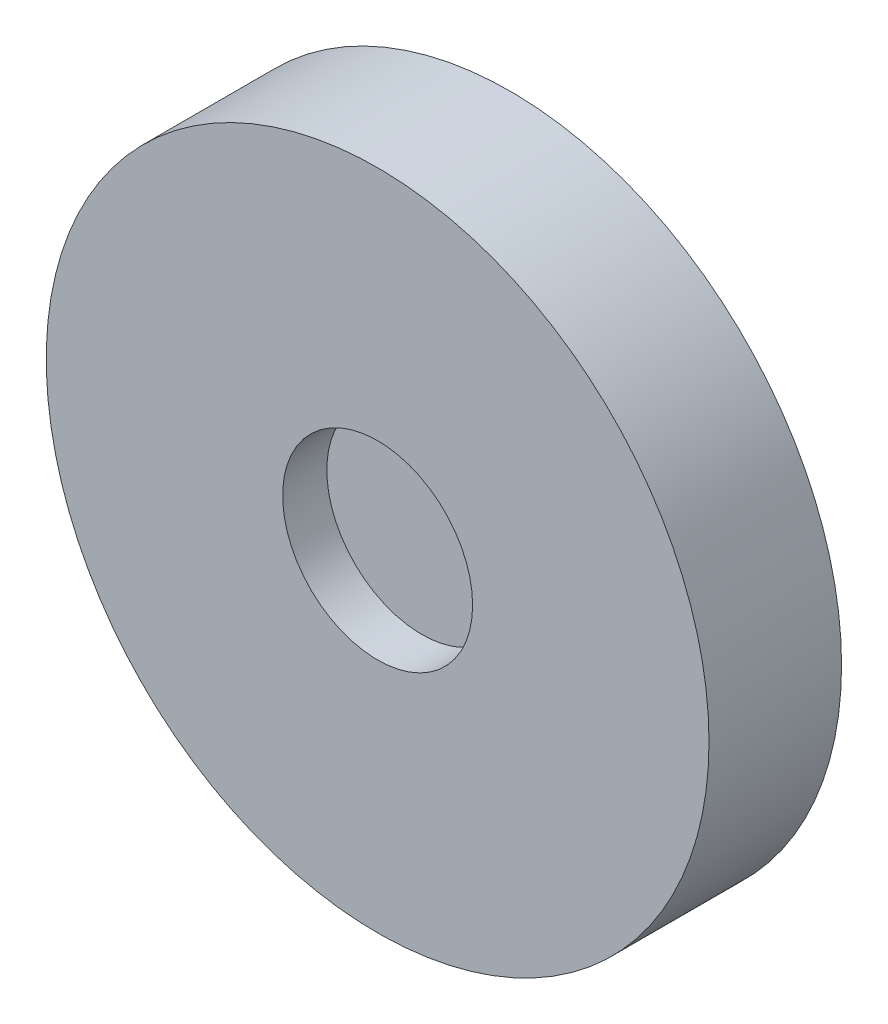
ISO-10303-21;
HEADER;
FILE_DESCRIPTION(('STEP AP214'),'2;1');
FILE_NAME('part.step','',(''),(''),'','','');
FILE_SCHEMA(('AUTOMOTIVE_DESIGN { 1 0 10303 214 1 1 1 1 }'));
ENDSEC;
DATA;
#1=APPLICATION_CONTEXT('core data for automotive mechanical design processes');
#2=APPLICATION_PROTOCOL_DEFINITION('international standard','automotive_design',2000,#1);
#3=PRODUCT_CONTEXT('',#1,'mechanical');
#4=PRODUCT('Part','Part','',(#3));
#5=PRODUCT_RELATED_PRODUCT_CATEGORY('part','',(#4));
#6=PRODUCT_DEFINITION_FORMATION('','',#4);
#7=PRODUCT_DEFINITION_CONTEXT('part definition',#1,'design');
#8=PRODUCT_DEFINITION('design','',#6,#7);
#9=PRODUCT_DEFINITION_SHAPE('','',#8);
#10=(LENGTH_UNIT() NAMED_UNIT(*) SI_UNIT(.MILLI.,.METRE.));
#11=(NAMED_UNIT(*) PLANE_ANGLE_UNIT() SI_UNIT($,.RADIAN.));
#12=(NAMED_UNIT(*) SI_UNIT($,.STERADIAN.) SOLID_ANGLE_UNIT());
#13=UNCERTAINTY_MEASURE_WITH_UNIT(LENGTH_MEASURE(1.E-05),#10,'distance_accuracy_value','');
#14=(GEOMETRIC_REPRESENTATION_CONTEXT(3) GLOBAL_UNCERTAINTY_ASSIGNED_CONTEXT((#13)) GLOBAL_UNIT_ASSIGNED_CONTEXT((#10,
#11,#12)) REPRESENTATION_CONTEXT('',''));
#15=CARTESIAN_POINT('',(0.,0.,0.));
#16=DIRECTION('',(0.,0.,1.));
#17=DIRECTION('',(1.,0.,0.));
#18=AXIS2_PLACEMENT_3D('',#15,#16,#17);
#19=CARTESIAN_POINT('',(0.,0.,3.));
#20=DIRECTION('',(0.,0.,-1.));
#21=DIRECTION('',(-1.,0.,0.));
#22=AXIS2_PLACEMENT_3D('',#19,#20,#21);
#23=CYLINDRICAL_SURFACE('',#22,7.5);
#24=CARTESIAN_POINT('',(0.,0.,3.));
#25=DIRECTION('',(0.,0.,1.));
#26=DIRECTION('',(1.,0.,0.));
#27=AXIS2_PLACEMENT_3D('',#24,#25,#26);
#28=CIRCLE('',#27,7.5);
#29=CARTESIAN_POINT('',(7.5,0.,3.));
#30=VERTEX_POINT('',#29);
#31=EDGE_CURVE('E10',#30,#30,#28,.T.);
#32=ORIENTED_EDGE('',*,*,#31,.F.);
#33=EDGE_LOOP('',(#32));
#34=FACE_BOUND('',#33,.T.);
#35=CARTESIAN_POINT('',(0.,0.,0.));
#36=DIRECTION('',(0.,0.,1.));
#37=DIRECTION('',(1.,0.,0.));
#38=AXIS2_PLACEMENT_3D('',#35,#36,#37);
#39=CIRCLE('',#38,7.5);
#40=CARTESIAN_POINT('',(7.5,0.,0.));
#41=VERTEX_POINT('',#40);
#42=EDGE_CURVE('E46',#41,#41,#39,.T.);
#43=ORIENTED_EDGE('',*,*,#42,.T.);
#44=EDGE_LOOP('',(#43));
#45=FACE_BOUND('',#44,.T.);
#46=ADVANCED_FACE('F43',(#34,#45),#23,.T.);
#47=CARTESIAN_POINT('',(0.,0.,3.));
#48=DIRECTION('',(0.,0.,1.));
#49=DIRECTION('',(1.,0.,0.));
#50=AXIS2_PLACEMENT_3D('',#47,#48,#49);
#51=PLANE('',#50);
#52=CARTESIAN_POINT('',(0.,0.,3.));
#53=DIRECTION('',(0.,0.,1.));
#54=DIRECTION('',(1.,0.,0.));
#55=AXIS2_PLACEMENT_3D('',#52,#53,#54);
#56=CIRCLE('',#55,2.15);
#57=CARTESIAN_POINT('',(2.15,0.,3.));
#58=VERTEX_POINT('',#57);
#59=EDGE_CURVE('E57',#58,#58,#56,.T.);
#60=ORIENTED_EDGE('',*,*,#59,.F.);
#61=EDGE_LOOP('',(#60));
#62=FACE_BOUND('',#61,.T.);
#63=ORIENTED_EDGE('',*,*,#31,.T.);
#64=EDGE_LOOP('',(#63));
#65=FACE_BOUND('',#64,.T.);
#66=ADVANCED_FACE('F74',(#62,#65),#51,.T.);
#67=CARTESIAN_POINT('',(0.,0.,0.));
#68=DIRECTION('',(0.,0.,1.));
#69=DIRECTION('',(1.,0.,0.));
#70=AXIS2_PLACEMENT_3D('',#67,#68,#69);
#71=PLANE('',#70);
#72=ORIENTED_EDGE('',*,*,#42,.F.);
#73=EDGE_LOOP('',(#72));
#74=FACE_BOUND('',#73,.T.);
#75=ADVANCED_FACE('F70',(#74),#71,.F.);
#76=CARTESIAN_POINT('',(0.,0.,2.));
#77=DIRECTION('',(0.,0.,1.));
#78=DIRECTION('',(1.,0.,0.));
#79=AXIS2_PLACEMENT_3D('',#76,#77,#78);
#80=CYLINDRICAL_SURFACE('',#79,2.15);
#81=CARTESIAN_POINT('',(0.,0.,2.));
#82=DIRECTION('',(0.,0.,1.));
#83=DIRECTION('',(1.,0.,0.));
#84=AXIS2_PLACEMENT_3D('',#81,#82,#83);
#85=CIRCLE('',#84,2.15);
#86=CARTESIAN_POINT('',(2.15,0.,2.));
#87=VERTEX_POINT('',#86);
#88=EDGE_CURVE('E55',#87,#87,#85,.T.);
#89=ORIENTED_EDGE('',*,*,#88,.F.);
#90=EDGE_LOOP('',(#89));
#91=FACE_BOUND('',#90,.T.);
#92=ORIENTED_EDGE('',*,*,#59,.T.);
#93=EDGE_LOOP('',(#92));
#94=FACE_BOUND('',#93,.T.);
#95=ADVANCED_FACE('F67',(#91,#94),#80,.F.);
#96=CARTESIAN_POINT('',(0.,0.,2.));
#97=DIRECTION('',(0.,0.,1.));
#98=DIRECTION('',(1.,0.,0.));
#99=AXIS2_PLACEMENT_3D('',#96,#97,#98);
#100=PLANE('',#99);
#101=ORIENTED_EDGE('',*,*,#88,.T.);
#102=EDGE_LOOP('',(#101));
#103=FACE_BOUND('',#102,.T.);
#104=ADVANCED_FACE('F65',(#103),#100,.T.);
#105=CLOSED_SHELL('',(#46,#66,#75,#95,#104));
#106=MANIFOLD_SOLID_BREP('B2',#105);
#107=ADVANCED_BREP_SHAPE_REPRESENTATION('',(#18,#106),#14);
#108=SHAPE_DEFINITION_REPRESENTATION(#9,#107);
ENDSEC;
END-ISO-10303-21;
